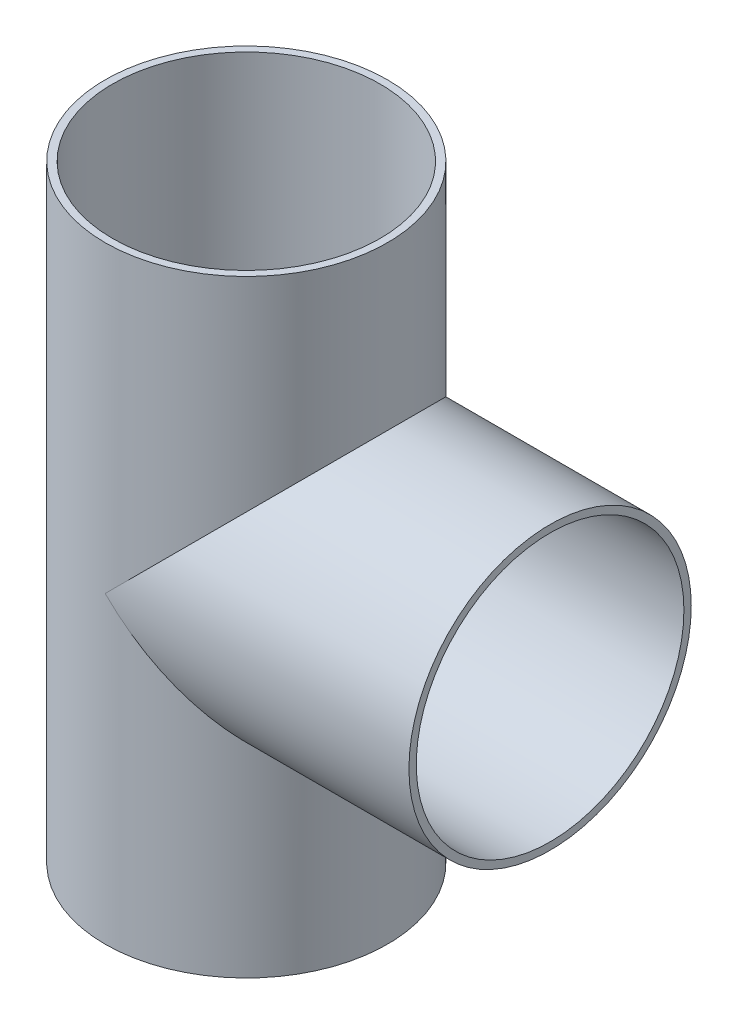
ISO-10303-21;
HEADER;
FILE_DESCRIPTION(('STEP AP214'),'2;1');
FILE_NAME('part.step','',(''),(''),'','','');
FILE_SCHEMA(('AUTOMOTIVE_DESIGN { 1 0 10303 214 1 1 1 1 }'));
ENDSEC;
DATA;
#1=APPLICATION_CONTEXT('core data for automotive mechanical design processes');
#2=APPLICATION_PROTOCOL_DEFINITION('international standard','automotive_design',2000,#1);
#3=PRODUCT_CONTEXT('',#1,'mechanical');
#4=PRODUCT('Part','Part','',(#3));
#5=PRODUCT_RELATED_PRODUCT_CATEGORY('part','',(#4));
#6=PRODUCT_DEFINITION_FORMATION('','',#4);
#7=PRODUCT_DEFINITION_CONTEXT('part definition',#1,'design');
#8=PRODUCT_DEFINITION('design','',#6,#7);
#9=PRODUCT_DEFINITION_SHAPE('','',#8);
#10=(LENGTH_UNIT() NAMED_UNIT(*) SI_UNIT(.MILLI.,.METRE.));
#11=(NAMED_UNIT(*) PLANE_ANGLE_UNIT() SI_UNIT($,.RADIAN.));
#12=(NAMED_UNIT(*) SI_UNIT($,.STERADIAN.) SOLID_ANGLE_UNIT());
#13=UNCERTAINTY_MEASURE_WITH_UNIT(LENGTH_MEASURE(1.E-05),#10,'distance_accuracy_value','');
#14=(GEOMETRIC_REPRESENTATION_CONTEXT(3) GLOBAL_UNCERTAINTY_ASSIGNED_CONTEXT((#13)) GLOBAL_UNIT_ASSIGNED_CONTEXT((#10,
#11,#12)) REPRESENTATION_CONTEXT('',''));
#15=CARTESIAN_POINT('',(0.,0.,0.));
#16=DIRECTION('',(0.,0.,1.));
#17=DIRECTION('',(1.,0.,0.));
#18=AXIS2_PLACEMENT_3D('',#15,#16,#17);
#19=CARTESIAN_POINT('',(0.,-68.326,0.));
#20=DIRECTION('',(0.,1.,0.));
#21=DIRECTION('',(0.,0.,1.));
#22=AXIS2_PLACEMENT_3D('',#19,#20,#21);
#23=CYLINDRICAL_SURFACE('',#22,31.75);
#24=CARTESIAN_POINT('',(0.,0.,0.));
#25=DIRECTION('',(0.707106781186548,0.707106781186548,0.));
#26=DIRECTION('',(0.707106781186547,-0.707106781186547,0.));
#27=AXIS2_PLACEMENT_3D('',#24,#25,#26);
#28=ELLIPSE('',#27,44.9012806053458,31.75);
#29=CARTESIAN_POINT('',(-5.6843418860808E-11,0.,-31.75));
#30=VERTEX_POINT('',#29);
#31=CARTESIAN_POINT('',(0.,0.,31.75));
#32=VERTEX_POINT('',#31);
#33=EDGE_CURVE('E71',#30,#32,#28,.F.);
#34=ORIENTED_EDGE('',*,*,#33,.T.);
#35=CARTESIAN_POINT('',(0.,0.,0.));
#36=DIRECTION('',(0.707106781186547,-0.707106781186547,0.));
#37=DIRECTION('',(0.707106781186548,0.707106781186548,0.));
#38=AXIS2_PLACEMENT_3D('',#35,#36,#37);
#39=ELLIPSE('',#38,44.9012806053458,31.75);
#40=EDGE_CURVE('E50',#32,#30,#39,.F.);
#41=ORIENTED_EDGE('',*,*,#40,.T.);
#42=EDGE_LOOP('',(#34,#41));
#43=FACE_BOUND('',#42,.T.);
#44=CARTESIAN_POINT('',(0.,-68.326,0.));
#45=DIRECTION('',(0.,1.,0.));
#46=DIRECTION('',(0.,0.,1.));
#47=AXIS2_PLACEMENT_3D('',#44,#45,#46);
#48=CIRCLE('',#47,31.75);
#49=CARTESIAN_POINT('',(0.,-68.326,31.75));
#50=VERTEX_POINT('',#49);
#51=EDGE_CURVE('E11',#50,#50,#48,.T.);
#52=ORIENTED_EDGE('',*,*,#51,.T.);
#53=EDGE_LOOP('',(#52));
#54=FACE_BOUND('',#53,.T.);
#55=CARTESIAN_POINT('',(0.,68.326,0.));
#56=DIRECTION('',(0.,1.,0.));
#57=DIRECTION('',(0.,0.,1.));
#58=AXIS2_PLACEMENT_3D('',#55,#56,#57);
#59=CIRCLE('',#58,31.75);
#60=CARTESIAN_POINT('',(0.,68.326,31.75));
#61=VERTEX_POINT('',#60);
#62=EDGE_CURVE('E37',#61,#61,#59,.T.);
#63=ORIENTED_EDGE('',*,*,#62,.F.);
#64=EDGE_LOOP('',(#63));
#65=FACE_BOUND('',#64,.T.);
#66=ADVANCED_FACE('F30',(#43,#54,#65),#23,.T.);
#67=CARTESIAN_POINT('',(0.,-68.326,0.));
#68=DIRECTION('',(0.,1.,0.));
#69=DIRECTION('',(0.,0.,1.));
#70=AXIS2_PLACEMENT_3D('',#67,#68,#69);
#71=PLANE('',#70);
#72=CARTESIAN_POINT('',(0.,-68.326,0.));
#73=DIRECTION('',(0.,1.,0.));
#74=DIRECTION('',(0.,0.,1.));
#75=AXIS2_PLACEMENT_3D('',#72,#73,#74);
#76=CIRCLE('',#75,30.099);
#77=CARTESIAN_POINT('',(0.,-68.326,30.099));
#78=VERTEX_POINT('',#77);
#79=EDGE_CURVE('E58',#78,#78,#76,.T.);
#80=ORIENTED_EDGE('',*,*,#79,.T.);
#81=EDGE_LOOP('',(#80));
#82=FACE_BOUND('',#81,.T.);
#83=ORIENTED_EDGE('',*,*,#51,.F.);
#84=EDGE_LOOP('',(#83));
#85=FACE_BOUND('',#84,.T.);
#86=ADVANCED_FACE('F79',(#82,#85),#71,.F.);
#87=CARTESIAN_POINT('',(0.,68.326,0.));
#88=DIRECTION('',(0.,1.,0.));
#89=DIRECTION('',(0.,0.,1.));
#90=AXIS2_PLACEMENT_3D('',#87,#88,#89);
#91=PLANE('',#90);
#92=CARTESIAN_POINT('',(0.,68.326,0.));
#93=DIRECTION('',(0.,1.,0.));
#94=DIRECTION('',(0.,0.,1.));
#95=AXIS2_PLACEMENT_3D('',#92,#93,#94);
#96=CIRCLE('',#95,30.099);
#97=CARTESIAN_POINT('',(0.,68.326,30.099));
#98=VERTEX_POINT('',#97);
#99=EDGE_CURVE('E116',#98,#98,#96,.T.);
#100=ORIENTED_EDGE('',*,*,#99,.F.);
#101=EDGE_LOOP('',(#100));
#102=FACE_BOUND('',#101,.T.);
#103=ORIENTED_EDGE('',*,*,#62,.T.);
#104=EDGE_LOOP('',(#103));
#105=FACE_BOUND('',#104,.T.);
#106=ADVANCED_FACE('F76',(#102,#105),#91,.T.);
#107=CARTESIAN_POINT('',(68.326,0.,0.));
#108=DIRECTION('',(1.,0.,0.));
#109=DIRECTION('',(0.,0.,-1.));
#110=AXIS2_PLACEMENT_3D('',#107,#108,#109);
#111=PLANE('',#110);
#112=CARTESIAN_POINT('',(68.326,0.,0.));
#113=DIRECTION('',(1.,0.,0.));
#114=DIRECTION('',(0.,0.,-1.));
#115=AXIS2_PLACEMENT_3D('',#112,#113,#114);
#116=CIRCLE('',#115,30.099);
#117=CARTESIAN_POINT('',(68.326,0.,-30.099));
#118=VERTEX_POINT('',#117);
#119=EDGE_CURVE('E62',#118,#118,#116,.T.);
#120=ORIENTED_EDGE('',*,*,#119,.F.);
#121=EDGE_LOOP('',(#120));
#122=FACE_BOUND('',#121,.T.);
#123=CARTESIAN_POINT('',(68.326,0.,0.));
#124=DIRECTION('',(1.,0.,0.));
#125=DIRECTION('',(0.,0.,-1.));
#126=AXIS2_PLACEMENT_3D('',#123,#124,#125);
#127=CIRCLE('',#126,31.75);
#128=CARTESIAN_POINT('',(68.326,0.,-31.75));
#129=VERTEX_POINT('',#128);
#130=EDGE_CURVE('E68',#129,#129,#127,.T.);
#131=ORIENTED_EDGE('',*,*,#130,.T.);
#132=EDGE_LOOP('',(#131));
#133=FACE_BOUND('',#132,.T.);
#134=ADVANCED_FACE('F91',(#122,#133),#111,.T.);
#135=CARTESIAN_POINT('',(-500000.,-1.01696429055664E-10,-4.6448955792755E-11));
#136=DIRECTION('',(1.,0.,0.));
#137=DIRECTION('',(0.,0.,-1.));
#138=AXIS2_PLACEMENT_3D('',#135,#136,#137);
#139=CYLINDRICAL_SURFACE('',#138,31.75);
#140=ORIENTED_EDGE('',*,*,#33,.F.);
#141=ORIENTED_EDGE('',*,*,#40,.F.);
#142=EDGE_LOOP('',(#140,#141));
#143=FACE_BOUND('',#142,.T.);
#144=ORIENTED_EDGE('',*,*,#130,.F.);
#145=EDGE_LOOP('',(#144));
#146=FACE_BOUND('',#145,.T.);
#147=ADVANCED_FACE('F88',(#143,#146),#139,.T.);
#148=CARTESIAN_POINT('',(0.,0.,0.));
#149=DIRECTION('',(1.,0.,0.));
#150=DIRECTION('',(0.,0.,-1.));
#151=AXIS2_PLACEMENT_3D('',#148,#149,#150);
#152=CYLINDRICAL_SURFACE('',#151,30.099);
#153=CARTESIAN_POINT('',(0.,0.,0.));
#154=DIRECTION('',(0.707106781186547,-0.707106781186547,0.));
#155=DIRECTION('',(0.707106781186548,0.707106781186548,0.));
#156=AXIS2_PLACEMENT_3D('',#153,#154,#155);
#157=ELLIPSE('',#156,42.5664140138678,30.099);
#158=CARTESIAN_POINT('',(0.,0.,30.099));
#159=VERTEX_POINT('',#158);
#160=CARTESIAN_POINT('',(0.,0.,-30.099));
#161=VERTEX_POINT('',#160);
#162=EDGE_CURVE('E55',#159,#161,#157,.F.);
#163=ORIENTED_EDGE('',*,*,#162,.T.);
#164=CARTESIAN_POINT('',(0.,0.,0.));
#165=DIRECTION('',(0.707106781186548,0.707106781186548,0.));
#166=DIRECTION('',(0.707106781186547,-0.707106781186547,0.));
#167=AXIS2_PLACEMENT_3D('',#164,#165,#166);
#168=ELLIPSE('',#167,42.5664140138678,30.099);
#169=EDGE_CURVE('E43',#161,#159,#168,.F.);
#170=ORIENTED_EDGE('',*,*,#169,.T.);
#171=EDGE_LOOP('',(#163,#170));
#172=FACE_BOUND('',#171,.T.);
#173=ORIENTED_EDGE('',*,*,#119,.T.);
#174=EDGE_LOOP('',(#173));
#175=FACE_BOUND('',#174,.T.);
#176=ADVANCED_FACE('F60',(#172,#175),#152,.F.);
#177=CARTESIAN_POINT('',(0.,-68.326,0.));
#178=DIRECTION('',(0.,1.,0.));
#179=DIRECTION('',(0.,0.,1.));
#180=AXIS2_PLACEMENT_3D('',#177,#178,#179);
#181=CYLINDRICAL_SURFACE('',#180,30.099);
#182=ORIENTED_EDGE('',*,*,#99,.T.);
#183=EDGE_LOOP('',(#182));
#184=FACE_BOUND('',#183,.T.);
#185=ORIENTED_EDGE('',*,*,#79,.F.);
#186=EDGE_LOOP('',(#185));
#187=FACE_BOUND('',#186,.T.);
#188=ORIENTED_EDGE('',*,*,#162,.F.);
#189=ORIENTED_EDGE('',*,*,#169,.F.);
#190=EDGE_LOOP('',(#188,#189));
#191=FACE_BOUND('',#190,.T.);
#192=ADVANCED_FACE('F56',(#184,#187,#191),#181,.F.);
#193=CLOSED_SHELL('',(#66,#86,#106,#134,#147,#176,#192));
#194=MANIFOLD_SOLID_BREP('B2',#193);
#195=ADVANCED_BREP_SHAPE_REPRESENTATION('',(#18,#194),#14);
#196=SHAPE_DEFINITION_REPRESENTATION(#9,#195);
ENDSEC;
END-ISO-10303-21;
